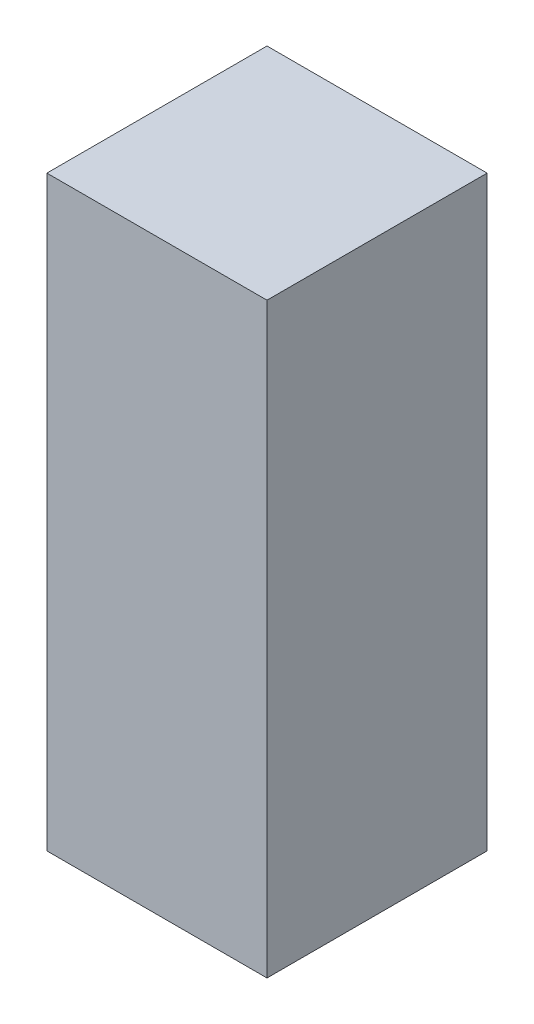
ISO-10303-21;
HEADER;
FILE_DESCRIPTION(('STEP AP214'),'2;1');
FILE_NAME('part.step','',(''),(''),'','','');
FILE_SCHEMA(('AUTOMOTIVE_DESIGN { 1 0 10303 214 1 1 1 1 }'));
ENDSEC;
DATA;
#1=APPLICATION_CONTEXT('core data for automotive mechanical design processes');
#2=APPLICATION_PROTOCOL_DEFINITION('international standard','automotive_design',2000,#1);
#3=PRODUCT_CONTEXT('',#1,'mechanical');
#4=PRODUCT('Part','Part','',(#3));
#5=PRODUCT_RELATED_PRODUCT_CATEGORY('part','',(#4));
#6=PRODUCT_DEFINITION_FORMATION('','',#4);
#7=PRODUCT_DEFINITION_CONTEXT('part definition',#1,'design');
#8=PRODUCT_DEFINITION('design','',#6,#7);
#9=PRODUCT_DEFINITION_SHAPE('','',#8);
#10=(LENGTH_UNIT() NAMED_UNIT(*) SI_UNIT(.MILLI.,.METRE.));
#11=(NAMED_UNIT(*) PLANE_ANGLE_UNIT() SI_UNIT($,.RADIAN.));
#12=(NAMED_UNIT(*) SI_UNIT($,.STERADIAN.) SOLID_ANGLE_UNIT());
#13=UNCERTAINTY_MEASURE_WITH_UNIT(LENGTH_MEASURE(1.E-05),#10,'distance_accuracy_value','');
#14=(GEOMETRIC_REPRESENTATION_CONTEXT(3) GLOBAL_UNCERTAINTY_ASSIGNED_CONTEXT((#13)) GLOBAL_UNIT_ASSIGNED_CONTEXT((#10,
#11,#12)) REPRESENTATION_CONTEXT('',''));
#15=CARTESIAN_POINT('',(0.,0.,0.));
#16=DIRECTION('',(0.,0.,1.));
#17=DIRECTION('',(1.,0.,0.));
#18=AXIS2_PLACEMENT_3D('',#15,#16,#17);
#19=CARTESIAN_POINT('',(0.,4.,0.));
#20=DIRECTION('',(1.,0.,0.));
#21=DIRECTION('',(0.,0.,-1.));
#22=AXIS2_PLACEMENT_3D('',#19,#20,#21);
#23=PLANE('',#22);
#24=DIRECTION('',(0.,0.,1.));
#25=VECTOR('',#24,1.);
#26=CARTESIAN_POINT('',(0.,0.,0.));
#27=LINE('',#26,#25);
#28=CARTESIAN_POINT('',(0.,0.,-1.5));
#29=VERTEX_POINT('',#28);
#30=CARTESIAN_POINT('',(0.,0.,0.));
#31=VERTEX_POINT('',#30);
#32=EDGE_CURVE('E107',#29,#31,#27,.T.);
#33=ORIENTED_EDGE('',*,*,#32,.T.);
#34=DIRECTION('',(0.,-1.,0.));
#35=VECTOR('',#34,1.);
#36=CARTESIAN_POINT('',(0.,4.,0.));
#37=LINE('',#36,#35);
#38=CARTESIAN_POINT('',(0.,4.,0.));
#39=VERTEX_POINT('',#38);
#40=EDGE_CURVE('E11',#39,#31,#37,.T.);
#41=ORIENTED_EDGE('',*,*,#40,.F.);
#42=DIRECTION('',(0.,0.,1.));
#43=VECTOR('',#42,1.);
#44=CARTESIAN_POINT('',(0.,4.,0.));
#45=LINE('',#44,#43);
#46=CARTESIAN_POINT('',(0.,4.,-1.5));
#47=VERTEX_POINT('',#46);
#48=EDGE_CURVE('E91',#47,#39,#45,.T.);
#49=ORIENTED_EDGE('',*,*,#48,.F.);
#50=DIRECTION('',(0.,-1.,0.));
#51=VECTOR('',#50,1.);
#52=CARTESIAN_POINT('',(0.,4.,-1.5));
#53=LINE('',#52,#51);
#54=EDGE_CURVE('E103',#47,#29,#53,.T.);
#55=ORIENTED_EDGE('',*,*,#54,.T.);
#56=EDGE_LOOP('',(#33,#41,#49,#55));
#57=FACE_BOUND('',#56,.T.);
#58=ADVANCED_FACE('F39',(#57),#23,.F.);
#59=CARTESIAN_POINT('',(0.,4.,0.));
#60=DIRECTION('',(0.,0.,-1.));
#61=DIRECTION('',(-1.,0.,0.));
#62=AXIS2_PLACEMENT_3D('',#59,#60,#61);
#63=PLANE('',#62);
#64=DIRECTION('',(1.,0.,0.));
#65=VECTOR('',#64,1.);
#66=CARTESIAN_POINT('',(0.,0.,0.));
#67=LINE('',#66,#65);
#68=CARTESIAN_POINT('',(1.5,0.,0.));
#69=VERTEX_POINT('',#68);
#70=EDGE_CURVE('E96',#31,#69,#67,.T.);
#71=ORIENTED_EDGE('',*,*,#70,.T.);
#72=DIRECTION('',(0.,-1.,0.));
#73=VECTOR('',#72,1.);
#74=CARTESIAN_POINT('',(1.5,4.,0.));
#75=LINE('',#74,#73);
#76=CARTESIAN_POINT('',(1.5,4.,0.));
#77=VERTEX_POINT('',#76);
#78=EDGE_CURVE('E48',#77,#69,#75,.T.);
#79=ORIENTED_EDGE('',*,*,#78,.F.);
#80=DIRECTION('',(1.,0.,0.));
#81=VECTOR('',#80,1.);
#82=CARTESIAN_POINT('',(0.,4.,0.));
#83=LINE('',#82,#81);
#84=EDGE_CURVE('E86',#39,#77,#83,.T.);
#85=ORIENTED_EDGE('',*,*,#84,.F.);
#86=ORIENTED_EDGE('',*,*,#40,.T.);
#87=EDGE_LOOP('',(#71,#79,#85,#86));
#88=FACE_BOUND('',#87,.T.);
#89=ADVANCED_FACE('F95',(#88),#63,.F.);
#90=CARTESIAN_POINT('',(1.5,4.,0.));
#91=DIRECTION('',(-1.,0.,0.));
#92=DIRECTION('',(0.,0.,1.));
#93=AXIS2_PLACEMENT_3D('',#90,#91,#92);
#94=PLANE('',#93);
#95=DIRECTION('',(0.,0.,-1.));
#96=VECTOR('',#95,1.);
#97=CARTESIAN_POINT('',(1.5,0.,0.));
#98=LINE('',#97,#96);
#99=CARTESIAN_POINT('',(1.5,0.,-1.5));
#100=VERTEX_POINT('',#99);
#101=EDGE_CURVE('E73',#69,#100,#98,.T.);
#102=ORIENTED_EDGE('',*,*,#101,.T.);
#103=DIRECTION('',(0.,-1.,0.));
#104=VECTOR('',#103,1.);
#105=CARTESIAN_POINT('',(1.5,4.,-1.5));
#106=LINE('',#105,#104);
#107=CARTESIAN_POINT('',(1.5,4.,-1.5));
#108=VERTEX_POINT('',#107);
#109=EDGE_CURVE('E98',#108,#100,#106,.T.);
#110=ORIENTED_EDGE('',*,*,#109,.F.);
#111=DIRECTION('',(0.,0.,-1.));
#112=VECTOR('',#111,1.);
#113=CARTESIAN_POINT('',(1.5,4.,0.));
#114=LINE('',#113,#112);
#115=EDGE_CURVE('E89',#77,#108,#114,.T.);
#116=ORIENTED_EDGE('',*,*,#115,.F.);
#117=ORIENTED_EDGE('',*,*,#78,.T.);
#118=EDGE_LOOP('',(#102,#110,#116,#117));
#119=FACE_BOUND('',#118,.T.);
#120=ADVANCED_FACE('F99',(#119),#94,.F.);
#121=CARTESIAN_POINT('',(0.,4.,-1.5));
#122=DIRECTION('',(0.,0.,1.));
#123=DIRECTION('',(1.,0.,0.));
#124=AXIS2_PLACEMENT_3D('',#121,#122,#123);
#125=PLANE('',#124);
#126=DIRECTION('',(-1.,0.,0.));
#127=VECTOR('',#126,1.);
#128=CARTESIAN_POINT('',(0.,0.,-1.5));
#129=LINE('',#128,#127);
#130=EDGE_CURVE('E79',#100,#29,#129,.T.);
#131=ORIENTED_EDGE('',*,*,#130,.T.);
#132=ORIENTED_EDGE('',*,*,#54,.F.);
#133=DIRECTION('',(-1.,0.,0.));
#134=VECTOR('',#133,1.);
#135=CARTESIAN_POINT('',(0.,4.,-1.5));
#136=LINE('',#135,#134);
#137=EDGE_CURVE('E56',#108,#47,#136,.T.);
#138=ORIENTED_EDGE('',*,*,#137,.F.);
#139=ORIENTED_EDGE('',*,*,#109,.T.);
#140=EDGE_LOOP('',(#131,#132,#138,#139));
#141=FACE_BOUND('',#140,.T.);
#142=ADVANCED_FACE('F120',(#141),#125,.F.);
#143=CARTESIAN_POINT('',(0.,4.,0.));
#144=DIRECTION('',(0.,-1.,0.));
#145=DIRECTION('',(0.,0.,-1.));
#146=AXIS2_PLACEMENT_3D('',#143,#144,#145);
#147=PLANE('',#146);
#148=ORIENTED_EDGE('',*,*,#48,.T.);
#149=ORIENTED_EDGE('',*,*,#84,.T.);
#150=ORIENTED_EDGE('',*,*,#115,.T.);
#151=ORIENTED_EDGE('',*,*,#137,.T.);
#152=EDGE_LOOP('',(#148,#149,#150,#151));
#153=FACE_BOUND('',#152,.T.);
#154=ADVANCED_FACE('F87',(#153),#147,.F.);
#155=CARTESIAN_POINT('',(0.,0.,0.));
#156=DIRECTION('',(0.,-1.,0.));
#157=DIRECTION('',(0.,0.,-1.));
#158=AXIS2_PLACEMENT_3D('',#155,#156,#157);
#159=PLANE('',#158);
#160=ORIENTED_EDGE('',*,*,#32,.F.);
#161=ORIENTED_EDGE('',*,*,#130,.F.);
#162=ORIENTED_EDGE('',*,*,#101,.F.);
#163=ORIENTED_EDGE('',*,*,#70,.F.);
#164=EDGE_LOOP('',(#160,#161,#162,#163));
#165=FACE_BOUND('',#164,.T.);
#166=ADVANCED_FACE('F123',(#165),#159,.T.);
#167=CLOSED_SHELL('',(#58,#89,#120,#142,#154,#166));
#168=MANIFOLD_SOLID_BREP('B2',#167);
#169=ADVANCED_BREP_SHAPE_REPRESENTATION('',(#18,#168),#14);
#170=SHAPE_DEFINITION_REPRESENTATION(#9,#169);
ENDSEC;
END-ISO-10303-21;
